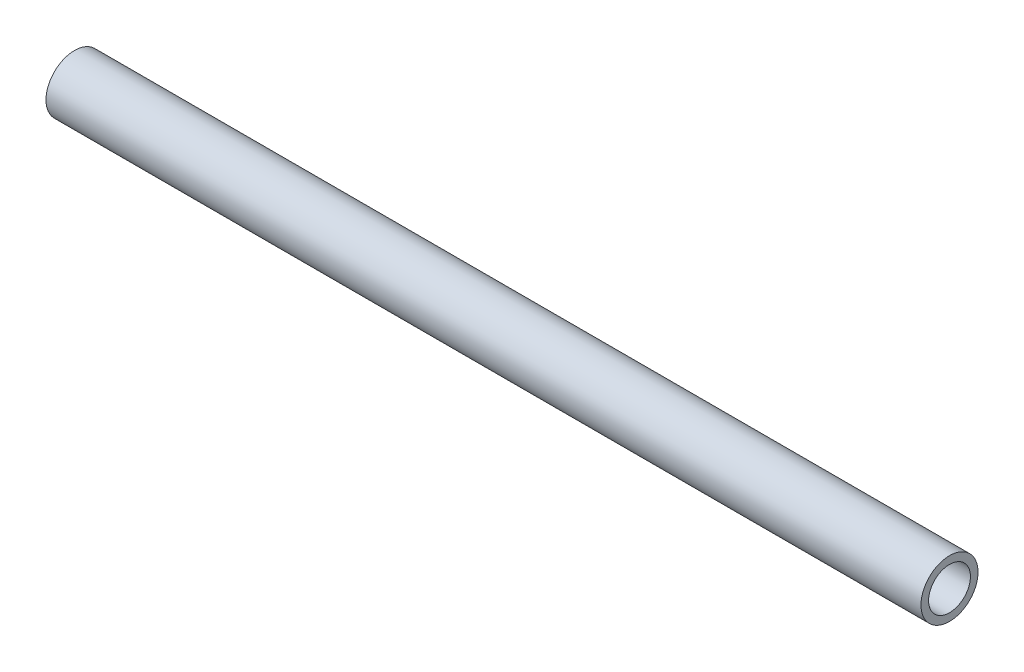
ISO-10303-21;
HEADER;
FILE_DESCRIPTION(('STEP AP214'),'2;1');
FILE_NAME('part.step','',(''),(''),'','','');
FILE_SCHEMA(('AUTOMOTIVE_DESIGN { 1 0 10303 214 1 1 1 1 }'));
ENDSEC;
DATA;
#1=APPLICATION_CONTEXT('core data for automotive mechanical design processes');
#2=APPLICATION_PROTOCOL_DEFINITION('international standard','automotive_design',2000,#1);
#3=PRODUCT_CONTEXT('',#1,'mechanical');
#4=PRODUCT('Part','Part','',(#3));
#5=PRODUCT_RELATED_PRODUCT_CATEGORY('part','',(#4));
#6=PRODUCT_DEFINITION_FORMATION('','',#4);
#7=PRODUCT_DEFINITION_CONTEXT('part definition',#1,'design');
#8=PRODUCT_DEFINITION('design','',#6,#7);
#9=PRODUCT_DEFINITION_SHAPE('','',#8);
#10=(LENGTH_UNIT() NAMED_UNIT(*) SI_UNIT(.MILLI.,.METRE.));
#11=(NAMED_UNIT(*) PLANE_ANGLE_UNIT() SI_UNIT($,.RADIAN.));
#12=(NAMED_UNIT(*) SI_UNIT($,.STERADIAN.) SOLID_ANGLE_UNIT());
#13=UNCERTAINTY_MEASURE_WITH_UNIT(LENGTH_MEASURE(1.E-05),#10,'distance_accuracy_value','');
#14=(GEOMETRIC_REPRESENTATION_CONTEXT(3) GLOBAL_UNCERTAINTY_ASSIGNED_CONTEXT((#13)) GLOBAL_UNIT_ASSIGNED_CONTEXT((#10,
#11,#12)) REPRESENTATION_CONTEXT('',''));
#15=CARTESIAN_POINT('',(0.,0.,0.));
#16=DIRECTION('',(0.,0.,1.));
#17=DIRECTION('',(1.,0.,0.));
#18=AXIS2_PLACEMENT_3D('',#15,#16,#17);
#19=CARTESIAN_POINT('',(49.7,2.25,0.));
#20=DIRECTION('',(1.,0.,0.));
#21=DIRECTION('',(0.,0.,-1.));
#22=AXIS2_PLACEMENT_3D('',#19,#20,#21);
#23=PLANE('',#22);
#24=CARTESIAN_POINT('',(49.7,0.,0.));
#25=DIRECTION('',(-1.,0.,0.));
#26=DIRECTION('',(0.,0.,1.));
#27=AXIS2_PLACEMENT_3D('',#24,#25,#26);
#28=CIRCLE('',#27,1.65);
#29=CARTESIAN_POINT('',(49.7,0.,1.65));
#30=VERTEX_POINT('',#29);
#31=EDGE_CURVE('E10',#30,#30,#28,.T.);
#32=ORIENTED_EDGE('',*,*,#31,.F.);
#33=EDGE_LOOP('',(#32));
#34=FACE_BOUND('',#33,.T.);
#35=CARTESIAN_POINT('',(49.7,0.,0.));
#36=DIRECTION('',(-1.,0.,0.));
#37=DIRECTION('',(0.,0.,1.));
#38=AXIS2_PLACEMENT_3D('',#35,#36,#37);
#39=CIRCLE('',#38,2.25);
#40=CARTESIAN_POINT('',(49.7,0.,2.25));
#41=VERTEX_POINT('',#40);
#42=EDGE_CURVE('E54',#41,#41,#39,.T.);
#43=ORIENTED_EDGE('',*,*,#42,.T.);
#44=EDGE_LOOP('',(#43));
#45=FACE_BOUND('',#44,.T.);
#46=ADVANCED_FACE('F37',(#34,#45),#23,.F.);
#47=CARTESIAN_POINT('',(-110.,0.,0.));
#48=DIRECTION('',(-1.,0.,0.));
#49=DIRECTION('',(0.,0.,1.));
#50=AXIS2_PLACEMENT_3D('',#47,#48,#49);
#51=CYLINDRICAL_SURFACE('',#50,1.65);
#52=CARTESIAN_POINT('',(118.7,0.,0.));
#53=DIRECTION('',(-1.,0.,0.));
#54=DIRECTION('',(0.,0.,1.));
#55=AXIS2_PLACEMENT_3D('',#52,#53,#54);
#56=CIRCLE('',#55,1.65);
#57=CARTESIAN_POINT('',(118.7,0.,1.65));
#58=VERTEX_POINT('',#57);
#59=EDGE_CURVE('E44',#58,#58,#56,.T.);
#60=ORIENTED_EDGE('',*,*,#59,.F.);
#61=EDGE_LOOP('',(#60));
#62=FACE_BOUND('',#61,.T.);
#63=ORIENTED_EDGE('',*,*,#31,.T.);
#64=EDGE_LOOP('',(#63));
#65=FACE_BOUND('',#64,.T.);
#66=ADVANCED_FACE('F70',(#62,#65),#51,.F.);
#67=CARTESIAN_POINT('',(118.7,1.65,0.));
#68=DIRECTION('',(-1.,0.,0.));
#69=DIRECTION('',(0.,0.,1.));
#70=AXIS2_PLACEMENT_3D('',#67,#68,#69);
#71=PLANE('',#70);
#72=CARTESIAN_POINT('',(118.7,0.,0.));
#73=DIRECTION('',(-1.,0.,0.));
#74=DIRECTION('',(0.,0.,1.));
#75=AXIS2_PLACEMENT_3D('',#72,#73,#74);
#76=CIRCLE('',#75,2.25);
#77=CARTESIAN_POINT('',(118.7,0.,2.25));
#78=VERTEX_POINT('',#77);
#79=EDGE_CURVE('E49',#78,#78,#76,.T.);
#80=ORIENTED_EDGE('',*,*,#79,.F.);
#81=EDGE_LOOP('',(#80));
#82=FACE_BOUND('',#81,.T.);
#83=ORIENTED_EDGE('',*,*,#59,.T.);
#84=EDGE_LOOP('',(#83));
#85=FACE_BOUND('',#84,.T.);
#86=ADVANCED_FACE('F65',(#82,#85),#71,.F.);
#87=CARTESIAN_POINT('',(-110.,0.,0.));
#88=DIRECTION('',(-1.,0.,0.));
#89=DIRECTION('',(0.,0.,1.));
#90=AXIS2_PLACEMENT_3D('',#87,#88,#89);
#91=CYLINDRICAL_SURFACE('',#90,2.25);
#92=ORIENTED_EDGE('',*,*,#42,.F.);
#93=EDGE_LOOP('',(#92));
#94=FACE_BOUND('',#93,.T.);
#95=ORIENTED_EDGE('',*,*,#79,.T.);
#96=EDGE_LOOP('',(#95));
#97=FACE_BOUND('',#96,.T.);
#98=ADVANCED_FACE('F62',(#94,#97),#91,.T.);
#99=CLOSED_SHELL('',(#46,#66,#86,#98));
#100=MANIFOLD_SOLID_BREP('B2',#99);
#101=ADVANCED_BREP_SHAPE_REPRESENTATION('',(#18,#100),#14);
#102=SHAPE_DEFINITION_REPRESENTATION(#9,#101);
ENDSEC;
END-ISO-10303-21;
